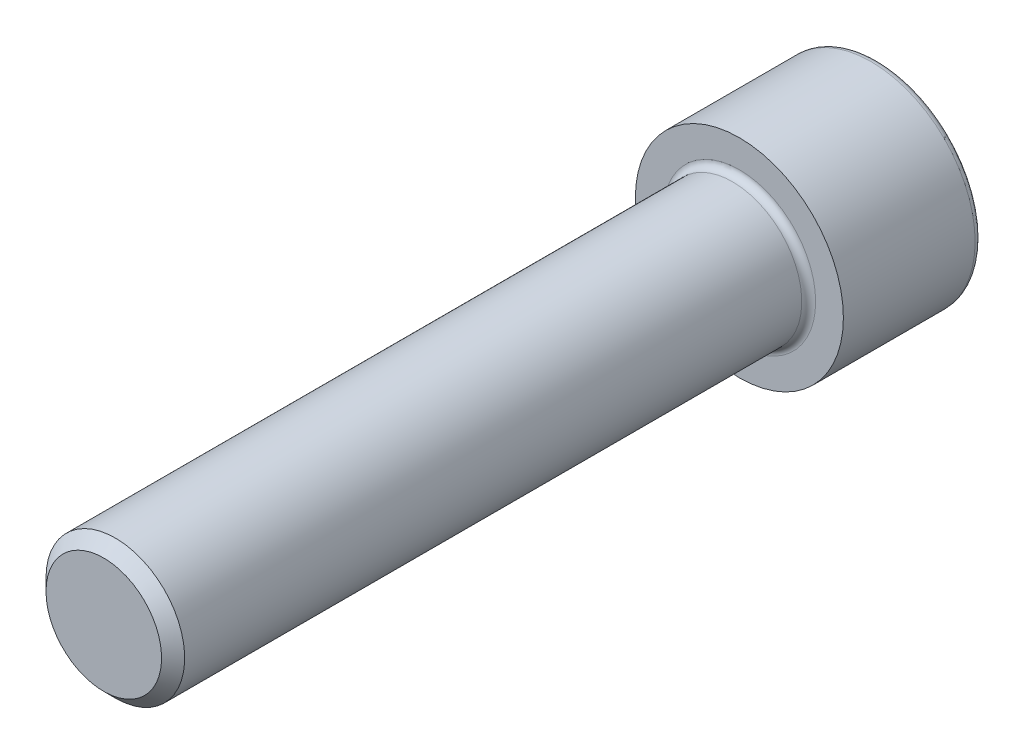
ISO-10303-21;
HEADER;
FILE_DESCRIPTION(('STEP AP214'),'2;1');
FILE_NAME('part.step','',(''),(''),'','','');
FILE_SCHEMA(('AUTOMOTIVE_DESIGN { 1 0 10303 214 1 1 1 1 }'));
ENDSEC;
DATA;
#1=APPLICATION_CONTEXT('core data for automotive mechanical design processes');
#2=APPLICATION_PROTOCOL_DEFINITION('international standard','automotive_design',2000,#1);
#3=PRODUCT_CONTEXT('',#1,'mechanical');
#4=PRODUCT('Part','Part','',(#3));
#5=PRODUCT_RELATED_PRODUCT_CATEGORY('part','',(#4));
#6=PRODUCT_DEFINITION_FORMATION('','',#4);
#7=PRODUCT_DEFINITION_CONTEXT('part definition',#1,'design');
#8=PRODUCT_DEFINITION('design','',#6,#7);
#9=PRODUCT_DEFINITION_SHAPE('','',#8);
#10=(LENGTH_UNIT() NAMED_UNIT(*) SI_UNIT(.MILLI.,.METRE.));
#11=(NAMED_UNIT(*) PLANE_ANGLE_UNIT() SI_UNIT($,.RADIAN.));
#12=(NAMED_UNIT(*) SI_UNIT($,.STERADIAN.) SOLID_ANGLE_UNIT());
#13=UNCERTAINTY_MEASURE_WITH_UNIT(LENGTH_MEASURE(1.E-05),#10,'distance_accuracy_value','');
#14=(GEOMETRIC_REPRESENTATION_CONTEXT(3) GLOBAL_UNCERTAINTY_ASSIGNED_CONTEXT((#13)) GLOBAL_UNIT_ASSIGNED_CONTEXT((#10,
#11,#12)) REPRESENTATION_CONTEXT('',''));
#15=CARTESIAN_POINT('',(0.,0.,0.));
#16=DIRECTION('',(0.,0.,1.));
#17=DIRECTION('',(1.,0.,0.));
#18=AXIS2_PLACEMENT_3D('',#15,#16,#17);
#19=CARTESIAN_POINT('',(0.,2.58905958954933E-07,-61.0000001301501));
#20=DIRECTION('',(0.,0.,-1.));
#21=DIRECTION('',(-1.,0.,0.));
#22=AXIS2_PLACEMENT_3D('',#19,#20,#21);
#23=CONICAL_SURFACE('',#22,5.00000021430971,1.04719754987744);
#24=CARTESIAN_POINT('',(-3.41060513164848E-10,2.59092303167563E-07,-58.113248652262));
#25=VERTEX_POINT('',#24);
#26=VERTEX_LOOP('',#25);
#27=FACE_BOUND('',#26,.T.);
#28=CARTESIAN_POINT('',(0.,2.58905959E-07,-61.0000000048103));
#29=DIRECTION('',(0.,0.,-1.));
#30=DIRECTION('',(0.877582561889793,-0.479425538605265,0.));
#31=AXIS2_PLACEMENT_3D('',#28,#29,#30);
#32=CIRCLE('',#31,4.99999999724702);
#33=CARTESIAN_POINT('',(-4.32955801739345,2.5009855340514,-61.0000000048196));
#34=VERTEX_POINT('',#33);
#35=CARTESIAN_POINT('',(-4.33069579146422,2.49901485155329,-61.0000000048196));
#36=VERTEX_POINT('',#35);
#37=EDGE_CURVE('E97',#34,#36,#32,.F.);
#38=ORIENTED_EDGE('',*,*,#37,.F.);
#39=CARTESIAN_POINT('',(0.,2.58905958954933E-07,-61.0000000048288));
#40=DIRECTION('',(0.,0.,-1.));
#41=DIRECTION('',(-1.,0.,0.));
#42=AXIS2_PLACEMENT_3D('',#39,#40,#41);
#43=CIRCLE('',#42,4.99999999724702);
#44=CARTESIAN_POINT('',(-0.0016090554776554,4.99999999724702,-61.0000000048196));
#45=VERTEX_POINT('',#44);
#46=EDGE_CURVE('E20',#34,#45,#43,.T.);
#47=ORIENTED_EDGE('',*,*,#46,.T.);
#48=CARTESIAN_POINT('',(0.,2.58905959E-07,-61.0000000048103));
#49=DIRECTION('',(0.,0.,-1.));
#50=DIRECTION('',(0.877582561889793,-0.479425538605265,0.));
#51=AXIS2_PLACEMENT_3D('',#48,#49,#50);
#52=CIRCLE('',#51,4.99999999724702);
#53=CARTESIAN_POINT('',(0.00160905547763964,4.99999999724702,-61.0000000048196));
#54=VERTEX_POINT('',#53);
#55=EDGE_CURVE('E106',#54,#45,#52,.F.);
#56=ORIENTED_EDGE('',*,*,#55,.F.);
#57=CARTESIAN_POINT('',(0.,2.58905958954933E-07,-61.0000000048288));
#58=DIRECTION('',(0.,0.,-1.));
#59=DIRECTION('',(-1.,0.,0.));
#60=AXIS2_PLACEMENT_3D('',#57,#58,#59);
#61=CIRCLE('',#60,4.99999999724702);
#62=CARTESIAN_POINT('',(4.32955811150432,2.50098558836334,-61.0000000675463));
#63=VERTEX_POINT('',#62);
#64=EDGE_CURVE('E114',#54,#63,#61,.T.);
#65=ORIENTED_EDGE('',*,*,#64,.T.);
#66=CARTESIAN_POINT('',(0.,2.58905959E-07,-61.0000001302637));
#67=DIRECTION('',(0.,0.,-1.));
#68=DIRECTION('',(0.877582561889051,-0.479425538606623,0.));
#69=AXIS2_PLACEMENT_3D('',#66,#67,#68);
#70=CIRCLE('',#69,5.00000021456376);
#71=CARTESIAN_POINT('',(4.33069590657441,2.49901491800317,-61.0000000815499));
#72=VERTEX_POINT('',#71);
#73=EDGE_CURVE('E133',#72,#63,#70,.F.);
#74=ORIENTED_EDGE('',*,*,#73,.F.);
#75=CARTESIAN_POINT('',(0.,2.58905958954933E-07,-61.000000032836));
#76=DIRECTION('',(0.,0.,-1.));
#77=DIRECTION('',(-1.,0.,0.));
#78=AXIS2_PLACEMENT_3D('',#75,#76,#77);
#79=CIRCLE('',#78,5.00000004575687);
#80=CARTESIAN_POINT('',(4.33013370935878,-2.49998832806004,-61.0000000468619));
#81=VERTEX_POINT('',#80);
#82=EDGE_CURVE('E150',#72,#81,#79,.T.);
#83=ORIENTED_EDGE('',*,*,#82,.T.);
#84=CARTESIAN_POINT('',(0.,2.58905958954933E-07,-61.0000000608877));
#85=DIRECTION('',(0.,0.,-1.));
#86=DIRECTION('',(-1.,0.,0.));
#87=AXIS2_PLACEMENT_3D('',#84,#85,#86);
#88=CIRCLE('',#87,5.00000009434387);
#89=CARTESIAN_POINT('',(-1.67829667138371E-10,-4.99999991771895,-61.0000000304439));
#90=VERTEX_POINT('',#89);
#91=EDGE_CURVE('E148',#81,#90,#88,.T.);
#92=ORIENTED_EDGE('',*,*,#91,.T.);
#93=CARTESIAN_POINT('',(0.,2.58905958954933E-07,-61.0000000173853));
#94=DIRECTION('',(0.,0.,-1.));
#95=DIRECTION('',(-1.,0.,0.));
#96=AXIS2_PLACEMENT_3D('',#93,#94,#95);
#97=CIRCLE('',#96,5.00000001899546);
#98=CARTESIAN_POINT('',(-4.33012889742087,-2.49999663588467,-61.0000000111071));
#99=VERTEX_POINT('',#98);
#100=EDGE_CURVE('E146',#90,#99,#97,.T.);
#101=ORIENTED_EDGE('',*,*,#100,.T.);
#102=CARTESIAN_POINT('',(0.,2.58905958954933E-07,-61.0000000048288));
#103=DIRECTION('',(0.,0.,-1.));
#104=DIRECTION('',(-1.,0.,0.));
#105=AXIS2_PLACEMENT_3D('',#102,#103,#104);
#106=CIRCLE('',#105,4.99999999724702);
#107=EDGE_CURVE('E101',#99,#36,#106,.T.);
#108=ORIENTED_EDGE('',*,*,#107,.T.);
#109=EDGE_LOOP('',(#38,#47,#56,#65,#74,#83,#92,#101,#108));
#110=FACE_BOUND('',#109,.T.);
#111=ADVANCED_FACE('F17',(#27,#110),#23,.F.);
#112=CARTESIAN_POINT('',(0.,0.,-61.));
#113=DIRECTION('',(0.,0.,1.));
#114=DIRECTION('',(1.,0.,0.));
#115=AXIS2_PLACEMENT_3D('',#112,#113,#114);
#116=PLANE('',#115);
#117=ORIENTED_EDGE('',*,*,#46,.F.);
#118=DIRECTION('',(-0.50000000000019,-0.866025403784329,0.));
#119=VECTOR('',#118,1.);
#120=CARTESIAN_POINT('',(-2.88675134595,5.,-61.));
#121=LINE('',#120,#119);
#122=CARTESIAN_POINT('',(-2.88675134595,5.,-61.));
#123=VERTEX_POINT('',#122);
#124=EDGE_CURVE('E110',#34,#123,#121,.F.);
#125=ORIENTED_EDGE('',*,*,#124,.T.);
#126=DIRECTION('',(1.,0.,0.));
#127=VECTOR('',#126,1.);
#128=CARTESIAN_POINT('',(2.88675134595,5.,-61.));
#129=LINE('',#128,#127);
#130=EDGE_CURVE('E113',#123,#45,#129,.T.);
#131=ORIENTED_EDGE('',*,*,#130,.T.);
#132=EDGE_LOOP('',(#117,#125,#131));
#133=FACE_BOUND('',#132,.T.);
#134=ADVANCED_FACE('F109',(#133),#116,.F.);
#135=CARTESIAN_POINT('',(0.,0.,-61.));
#136=DIRECTION('',(0.,0.,1.));
#137=DIRECTION('',(1.,0.,0.));
#138=AXIS2_PLACEMENT_3D('',#135,#136,#137);
#139=PLANE('',#138);
#140=ORIENTED_EDGE('',*,*,#64,.F.);
#141=DIRECTION('',(1.,0.,0.));
#142=VECTOR('',#141,1.);
#143=CARTESIAN_POINT('',(2.88675134595,5.,-61.));
#144=LINE('',#143,#142);
#145=CARTESIAN_POINT('',(2.8867513459502,5.00000000000012,-61.));
#146=VERTEX_POINT('',#145);
#147=EDGE_CURVE('E160',#54,#146,#144,.T.);
#148=ORIENTED_EDGE('',*,*,#147,.T.);
#149=DIRECTION('',(-0.50000000000019,0.866025403784329,0.));
#150=VECTOR('',#149,1.);
#151=CARTESIAN_POINT('',(5.7735026919,0.,-61.));
#152=LINE('',#151,#150);
#153=EDGE_CURVE('E158',#146,#63,#152,.F.);
#154=ORIENTED_EDGE('',*,*,#153,.T.);
#155=EDGE_LOOP('',(#140,#148,#154));
#156=FACE_BOUND('',#155,.T.);
#157=ADVANCED_FACE('F159',(#156),#139,.F.);
#158=CARTESIAN_POINT('',(0.,0.,-61.));
#159=DIRECTION('',(0.,0.,1.));
#160=DIRECTION('',(1.,0.,0.));
#161=AXIS2_PLACEMENT_3D('',#158,#159,#160);
#162=PLANE('',#161);
#163=ORIENTED_EDGE('',*,*,#82,.F.);
#164=DIRECTION('',(-0.50000000000019,0.866025403784329,0.));
#165=VECTOR('',#164,1.);
#166=CARTESIAN_POINT('',(5.7735026919,0.,-60.9999999992792));
#167=LINE('',#166,#165);
#168=CARTESIAN_POINT('',(5.7735026918998,1.19937335520785E-13,-60.9999999997597));
#169=VERTEX_POINT('',#168);
#170=EDGE_CURVE('E164',#72,#169,#167,.F.);
#171=ORIENTED_EDGE('',*,*,#170,.T.);
#172=DIRECTION('',(0.50000000000019,0.866025403784329,0.));
#173=VECTOR('',#172,1.);
#174=CARTESIAN_POINT('',(2.88675134595,-5.,-61.));
#175=LINE('',#174,#173);
#176=EDGE_CURVE('E200',#169,#81,#175,.F.);
#177=ORIENTED_EDGE('',*,*,#176,.T.);
#178=EDGE_LOOP('',(#163,#171,#177));
#179=FACE_BOUND('',#178,.T.);
#180=ADVANCED_FACE('F480',(#179),#162,.F.);
#181=CARTESIAN_POINT('',(0.,0.,-61.));
#182=DIRECTION('',(0.,0.,1.));
#183=DIRECTION('',(1.,0.,0.));
#184=AXIS2_PLACEMENT_3D('',#181,#182,#183);
#185=PLANE('',#184);
#186=ORIENTED_EDGE('',*,*,#91,.F.);
#187=DIRECTION('',(0.50000000000019,0.866025403784329,0.));
#188=VECTOR('',#187,1.);
#189=CARTESIAN_POINT('',(2.88675134595,-5.,-61.0000000000101));
#190=LINE('',#189,#188);
#191=CARTESIAN_POINT('',(2.88675134595,-5.,-61.0000000000034));
#192=VERTEX_POINT('',#191);
#193=EDGE_CURVE('E205',#81,#192,#190,.F.);
#194=ORIENTED_EDGE('',*,*,#193,.T.);
#195=DIRECTION('',(1.,0.,0.));
#196=VECTOR('',#195,1.);
#197=CARTESIAN_POINT('',(-2.88675134595,-5.,-61.));
#198=LINE('',#197,#196);
#199=EDGE_CURVE('E216',#192,#90,#198,.F.);
#200=ORIENTED_EDGE('',*,*,#199,.T.);
#201=EDGE_LOOP('',(#186,#194,#200));
#202=FACE_BOUND('',#201,.T.);
#203=ADVANCED_FACE('F470',(#202),#185,.F.);
#204=CARTESIAN_POINT('',(0.,0.,-61.));
#205=DIRECTION('',(0.,0.,1.));
#206=DIRECTION('',(1.,0.,0.));
#207=AXIS2_PLACEMENT_3D('',#204,#205,#206);
#208=PLANE('',#207);
#209=ORIENTED_EDGE('',*,*,#100,.F.);
#210=DIRECTION('',(1.,0.,0.));
#211=VECTOR('',#210,1.);
#212=CARTESIAN_POINT('',(-2.88675134595,-5.,-61.0000000000087));
#213=LINE('',#212,#211);
#214=CARTESIAN_POINT('',(-2.88675134595021,-5.00000000000012,-61.0000000000029));
#215=VERTEX_POINT('',#214);
#216=EDGE_CURVE('E221',#90,#215,#213,.F.);
#217=ORIENTED_EDGE('',*,*,#216,.T.);
#218=DIRECTION('',(0.50000000000019,-0.866025403784329,0.));
#219=VECTOR('',#218,1.);
#220=CARTESIAN_POINT('',(-5.7735026919,0.,-61.));
#221=LINE('',#220,#219);
#222=EDGE_CURVE('E238',#215,#99,#221,.F.);
#223=ORIENTED_EDGE('',*,*,#222,.T.);
#224=EDGE_LOOP('',(#209,#217,#223));
#225=FACE_BOUND('',#224,.T.);
#226=ADVANCED_FACE('F460',(#225),#208,.F.);
#227=CARTESIAN_POINT('',(0.,0.,-61.));
#228=DIRECTION('',(0.,0.,1.));
#229=DIRECTION('',(1.,0.,0.));
#230=AXIS2_PLACEMENT_3D('',#227,#228,#229);
#231=PLANE('',#230);
#232=ORIENTED_EDGE('',*,*,#107,.F.);
#233=DIRECTION('',(0.50000000000019,-0.866025403784329,0.));
#234=VECTOR('',#233,1.);
#235=CARTESIAN_POINT('',(-5.7735026919,0.,-60.9999999845561));
#236=LINE('',#235,#234);
#237=CARTESIAN_POINT('',(-5.77350269189988,-1.15868320693607E-13,-60.9999999922781));
#238=VERTEX_POINT('',#237);
#239=EDGE_CURVE('E243',#99,#238,#236,.F.);
#240=ORIENTED_EDGE('',*,*,#239,.T.);
#241=DIRECTION('',(-0.50000000000019,-0.866025403784329,0.));
#242=VECTOR('',#241,1.);
#243=CARTESIAN_POINT('',(-2.88675134595,5.,-61.));
#244=LINE('',#243,#242);
#245=EDGE_CURVE('E118',#238,#36,#244,.F.);
#246=ORIENTED_EDGE('',*,*,#245,.T.);
#247=EDGE_LOOP('',(#232,#240,#246));
#248=FACE_BOUND('',#247,.T.);
#249=ADVANCED_FACE('F451',(#248),#231,.F.);
#250=CARTESIAN_POINT('',(-2.88675134595,5.,-67.));
#251=DIRECTION('',(-0.866025403784329,0.50000000000019,0.));
#252=DIRECTION('',(-0.50000000000019,-0.866025403784329,0.));
#253=AXIS2_PLACEMENT_3D('',#250,#251,#252);
#254=PLANE('',#253);
#255=DIRECTION('',(0.,0.,1.));
#256=VECTOR('',#255,1.);
#257=CARTESIAN_POINT('',(-2.88675134595,5.,-67.));
#258=LINE('',#257,#256);
#259=CARTESIAN_POINT('',(-2.88675134595,5.,-67.));
#260=VERTEX_POINT('',#259);
#261=EDGE_CURVE('E117',#260,#123,#258,.T.);
#262=ORIENTED_EDGE('',*,*,#261,.T.);
#263=ORIENTED_EDGE('',*,*,#124,.F.);
#264=ORIENTED_EDGE('',*,*,#37,.T.);
#265=ORIENTED_EDGE('',*,*,#245,.F.);
#266=DIRECTION('',(0.,0.,1.));
#267=VECTOR('',#266,1.);
#268=CARTESIAN_POINT('',(-5.7735026919,0.,-67.));
#269=LINE('',#268,#267);
#270=CARTESIAN_POINT('',(-5.77350269189985,0.,-67.));
#271=VERTEX_POINT('',#270);
#272=EDGE_CURVE('E130',#238,#271,#269,.F.);
#273=ORIENTED_EDGE('',*,*,#272,.T.);
#274=DIRECTION('',(0.500000000000243,0.866025403784298,0.));
#275=VECTOR('',#274,1.);
#276=CARTESIAN_POINT('',(-5.7735026919,0.,-67.));
#277=LINE('',#276,#275);
#278=EDGE_CURVE('E127',#271,#260,#277,.T.);
#279=ORIENTED_EDGE('',*,*,#278,.T.);
#280=EDGE_LOOP('',(#262,#263,#264,#265,#273,#279));
#281=FACE_BOUND('',#280,.T.);
#282=ADVANCED_FACE('F115',(#281),#254,.F.);
#283=CARTESIAN_POINT('',(2.88675134595,5.,-67.));
#284=DIRECTION('',(0.,1.,0.));
#285=DIRECTION('',(0.,0.,1.));
#286=AXIS2_PLACEMENT_3D('',#283,#284,#285);
#287=PLANE('',#286);
#288=ORIENTED_EDGE('',*,*,#55,.T.);
#289=ORIENTED_EDGE('',*,*,#130,.F.);
#290=ORIENTED_EDGE('',*,*,#261,.F.);
#291=DIRECTION('',(1.,0.,0.));
#292=VECTOR('',#291,1.);
#293=CARTESIAN_POINT('',(0.,5.,-67.));
#294=LINE('',#293,#292);
#295=CARTESIAN_POINT('',(2.88675134595015,5.00000000000009,-67.));
#296=VERTEX_POINT('',#295);
#297=EDGE_CURVE('E129',#260,#296,#294,.T.);
#298=ORIENTED_EDGE('',*,*,#297,.T.);
#299=DIRECTION('',(0.,0.,1.));
#300=VECTOR('',#299,1.);
#301=CARTESIAN_POINT('',(2.88675134595031,5.00000000000018,-67.));
#302=LINE('',#301,#300);
#303=EDGE_CURVE('E165',#296,#146,#302,.T.);
#304=ORIENTED_EDGE('',*,*,#303,.T.);
#305=ORIENTED_EDGE('',*,*,#147,.F.);
#306=EDGE_LOOP('',(#288,#289,#290,#298,#304,#305));
#307=FACE_BOUND('',#306,.T.);
#308=ADVANCED_FACE('F434',(#307),#287,.F.);
#309=CARTESIAN_POINT('',(5.7735026919,0.,-67.));
#310=DIRECTION('',(0.866025403784329,0.50000000000019,0.));
#311=DIRECTION('',(-0.50000000000019,0.866025403784329,0.));
#312=AXIS2_PLACEMENT_3D('',#309,#310,#311);
#313=PLANE('',#312);
#314=ORIENTED_EDGE('',*,*,#73,.T.);
#315=ORIENTED_EDGE('',*,*,#153,.F.);
#316=ORIENTED_EDGE('',*,*,#303,.F.);
#317=DIRECTION('',(0.500000000000243,-0.866025403784298,0.));
#318=VECTOR('',#317,1.);
#319=CARTESIAN_POINT('',(2.88675134595,5.,-67.));
#320=LINE('',#319,#318);
#321=CARTESIAN_POINT('',(5.77350269189985,0.,-67.));
#322=VERTEX_POINT('',#321);
#323=EDGE_CURVE('E182',#296,#322,#320,.T.);
#324=ORIENTED_EDGE('',*,*,#323,.T.);
#325=DIRECTION('',(0.,0.,1.));
#326=VECTOR('',#325,1.);
#327=CARTESIAN_POINT('',(5.77350269189969,1.78676518025611E-13,-67.));
#328=LINE('',#327,#326);
#329=EDGE_CURVE('E167',#322,#169,#328,.T.);
#330=ORIENTED_EDGE('',*,*,#329,.T.);
#331=ORIENTED_EDGE('',*,*,#170,.F.);
#332=EDGE_LOOP('',(#314,#315,#316,#324,#330,#331));
#333=FACE_BOUND('',#332,.T.);
#334=ADVANCED_FACE('F424',(#333),#313,.F.);
#335=CARTESIAN_POINT('',(2.88675134595,-5.,-67.));
#336=DIRECTION('',(0.866025403784329,-0.50000000000019,0.));
#337=DIRECTION('',(0.50000000000019,0.866025403784329,0.));
#338=AXIS2_PLACEMENT_3D('',#335,#336,#337);
#339=PLANE('',#338);
#340=ORIENTED_EDGE('',*,*,#176,.F.);
#341=ORIENTED_EDGE('',*,*,#329,.F.);
#342=DIRECTION('',(-0.500000000000243,-0.866025403784298,0.));
#343=VECTOR('',#342,1.);
#344=CARTESIAN_POINT('',(5.7735026919,0.,-67.));
#345=LINE('',#344,#343);
#346=CARTESIAN_POINT('',(2.88675134595,-5.,-67.));
#347=VERTEX_POINT('',#346);
#348=EDGE_CURVE('E189',#322,#347,#345,.T.);
#349=ORIENTED_EDGE('',*,*,#348,.T.);
#350=DIRECTION('',(0.,0.,-1.));
#351=VECTOR('',#350,1.);
#352=CARTESIAN_POINT('',(2.88675134595,-5.,-67.));
#353=LINE('',#352,#351);
#354=EDGE_CURVE('E211',#347,#192,#353,.F.);
#355=ORIENTED_EDGE('',*,*,#354,.T.);
#356=ORIENTED_EDGE('',*,*,#193,.F.);
#357=EDGE_LOOP('',(#340,#341,#349,#355,#356));
#358=FACE_BOUND('',#357,.T.);
#359=ADVANCED_FACE('F415',(#358),#339,.F.);
#360=CARTESIAN_POINT('',(-2.88675134595,-5.,-67.));
#361=DIRECTION('',(0.,-1.,0.));
#362=DIRECTION('',(0.,0.,-1.));
#363=AXIS2_PLACEMENT_3D('',#360,#361,#362);
#364=PLANE('',#363);
#365=ORIENTED_EDGE('',*,*,#199,.F.);
#366=ORIENTED_EDGE('',*,*,#354,.F.);
#367=DIRECTION('',(1.,0.,0.));
#368=VECTOR('',#367,1.);
#369=CARTESIAN_POINT('',(0.,-5.,-67.));
#370=LINE('',#369,#368);
#371=CARTESIAN_POINT('',(-2.88675134595031,-5.00000000000018,-67.));
#372=VERTEX_POINT('',#371);
#373=EDGE_CURVE('E35',#347,#372,#370,.F.);
#374=ORIENTED_EDGE('',*,*,#373,.T.);
#375=DIRECTION('',(0.,0.,1.));
#376=VECTOR('',#375,1.);
#377=CARTESIAN_POINT('',(-2.88675134595031,-5.00000000000018,-67.));
#378=LINE('',#377,#376);
#379=EDGE_CURVE('E234',#372,#215,#378,.T.);
#380=ORIENTED_EDGE('',*,*,#379,.T.);
#381=ORIENTED_EDGE('',*,*,#216,.F.);
#382=EDGE_LOOP('',(#365,#366,#374,#380,#381));
#383=FACE_BOUND('',#382,.T.);
#384=ADVANCED_FACE('F406',(#383),#364,.F.);
#385=CARTESIAN_POINT('',(-5.7735026919,0.,-67.));
#386=DIRECTION('',(-0.866025403784329,-0.50000000000019,0.));
#387=DIRECTION('',(0.50000000000019,-0.866025403784329,0.));
#388=AXIS2_PLACEMENT_3D('',#385,#386,#387);
#389=PLANE('',#388);
#390=ORIENTED_EDGE('',*,*,#272,.F.);
#391=ORIENTED_EDGE('',*,*,#239,.F.);
#392=ORIENTED_EDGE('',*,*,#222,.F.);
#393=ORIENTED_EDGE('',*,*,#379,.F.);
#394=DIRECTION('',(-0.500000000000243,0.866025403784298,0.));
#395=VECTOR('',#394,1.);
#396=CARTESIAN_POINT('',(-2.88675134595,-5.,-67.));
#397=LINE('',#396,#395);
#398=EDGE_CURVE('E224',#372,#271,#397,.T.);
#399=ORIENTED_EDGE('',*,*,#398,.T.);
#400=EDGE_LOOP('',(#390,#391,#392,#393,#399));
#401=FACE_BOUND('',#400,.T.);
#402=ADVANCED_FACE('F397',(#401),#389,.F.);
#403=CARTESIAN_POINT('',(0.,0.,-67.));
#404=DIRECTION('',(0.,0.,1.));
#405=DIRECTION('',(1.,0.,0.));
#406=AXIS2_PLACEMENT_3D('',#403,#404,#405);
#407=PLANE('',#406);
#408=ORIENTED_EDGE('',*,*,#373,.F.);
#409=ORIENTED_EDGE('',*,*,#348,.F.);
#410=ORIENTED_EDGE('',*,*,#323,.F.);
#411=ORIENTED_EDGE('',*,*,#297,.F.);
#412=ORIENTED_EDGE('',*,*,#278,.F.);
#413=ORIENTED_EDGE('',*,*,#398,.F.);
#414=EDGE_LOOP('',(#408,#409,#410,#411,#412,#413));
#415=FACE_BOUND('',#414,.T.);
#416=CARTESIAN_POINT('',(0.,0.,-67.));
#417=DIRECTION('',(0.,0.,1.));
#418=DIRECTION('',(1.,0.,0.));
#419=AXIS2_PLACEMENT_3D('',#416,#417,#418);
#420=CIRCLE('',#419,8.4);
#421=CARTESIAN_POINT('',(8.4,0.,-67.));
#422=VERTEX_POINT('',#421);
#423=EDGE_CURVE('E227',#422,#422,#420,.T.);
#424=ORIENTED_EDGE('',*,*,#423,.F.);
#425=EDGE_LOOP('',(#424));
#426=FACE_BOUND('',#425,.T.);
#427=ADVANCED_FACE('F271',(#415,#426),#407,.F.);
#428=CARTESIAN_POINT('',(0.,0.,-66.4));
#429=DIRECTION('',(0.,0.,-1.));
#430=DIRECTION('',(1.,0.,0.));
#431=AXIS2_PLACEMENT_3D('',#428,#429,#430);
#432=TOROIDAL_SURFACE('',#431,8.4,0.6);
#433=CARTESIAN_POINT('',(0.,0.,-66.4));
#434=DIRECTION('',(0.,0.,1.));
#435=DIRECTION('',(1.,0.,0.));
#436=AXIS2_PLACEMENT_3D('',#433,#434,#435);
#437=CIRCLE('',#436,9.);
#438=CARTESIAN_POINT('',(9.,0.,-66.4));
#439=VERTEX_POINT('',#438);
#440=EDGE_CURVE('E144',#439,#439,#437,.T.);
#441=ORIENTED_EDGE('',*,*,#440,.F.);
#442=EDGE_LOOP('',(#441));
#443=FACE_BOUND('',#442,.T.);
#444=ORIENTED_EDGE('',*,*,#423,.T.);
#445=EDGE_LOOP('',(#444));
#446=FACE_BOUND('',#445,.T.);
#447=ADVANCED_FACE('F259',(#443,#446),#432,.T.);
#448=CARTESIAN_POINT('',(0.,0.,-33.5));
#449=DIRECTION('',(0.,0.,1.));
#450=DIRECTION('',(1.,0.,0.));
#451=AXIS2_PLACEMENT_3D('',#448,#449,#450);
#452=CYLINDRICAL_SURFACE('',#451,9.);
#453=CARTESIAN_POINT('',(0.,0.,-55.));
#454=DIRECTION('',(0.,0.,1.));
#455=DIRECTION('',(1.,0.,0.));
#456=AXIS2_PLACEMENT_3D('',#453,#454,#455);
#457=CIRCLE('',#456,9.);
#458=CARTESIAN_POINT('',(9.,0.,-55.));
#459=VERTEX_POINT('',#458);
#460=EDGE_CURVE('E141',#459,#459,#457,.F.);
#461=ORIENTED_EDGE('',*,*,#460,.T.);
#462=EDGE_LOOP('',(#461));
#463=FACE_BOUND('',#462,.T.);
#464=ORIENTED_EDGE('',*,*,#440,.T.);
#465=EDGE_LOOP('',(#464));
#466=FACE_BOUND('',#465,.T.);
#467=ADVANCED_FACE('F270',(#463,#466),#452,.T.);
#468=CARTESIAN_POINT('',(0.,0.,-55.));
#469=DIRECTION('',(0.,0.,-1.));
#470=DIRECTION('',(-1.,0.,0.));
#471=AXIS2_PLACEMENT_3D('',#468,#469,#470);
#472=PLANE('',#471);
#473=CARTESIAN_POINT('',(0.,0.,-55.));
#474=DIRECTION('',(0.,0.,1.));
#475=DIRECTION('',(1.,0.,0.));
#476=AXIS2_PLACEMENT_3D('',#473,#474,#475);
#477=CIRCLE('',#476,6.60000000000001);
#478=CARTESIAN_POINT('',(6.6,0.,-55.));
#479=VERTEX_POINT('',#478);
#480=EDGE_CURVE('E140',#479,#479,#477,.F.);
#481=ORIENTED_EDGE('',*,*,#480,.T.);
#482=EDGE_LOOP('',(#481));
#483=FACE_BOUND('',#482,.T.);
#484=ORIENTED_EDGE('',*,*,#460,.F.);
#485=EDGE_LOOP('',(#484));
#486=FACE_BOUND('',#485,.T.);
#487=ADVANCED_FACE('F325',(#483,#486),#472,.F.);
#488=CARTESIAN_POINT('',(0.,0.,0.));
#489=DIRECTION('',(0.,0.,1.));
#490=DIRECTION('',(1.,0.,0.));
#491=AXIS2_PLACEMENT_3D('',#488,#489,#490);
#492=PLANE('',#491);
#493=CARTESIAN_POINT('',(0.,0.,-3.5811353882309E-09));
#494=DIRECTION('',(0.,0.,-1.));
#495=DIRECTION('',(-1.,0.,0.));
#496=AXIS2_PLACEMENT_3D('',#493,#494,#495);
#497=CIRCLE('',#496,4.99999999647116);
#498=CARTESIAN_POINT('',(-4.99999999647117,0.,-3.5811353882309E-09));
#499=VERTEX_POINT('',#498);
#500=EDGE_CURVE('E137',#499,#499,#497,.T.);
#501=ORIENTED_EDGE('',*,*,#500,.F.);
#502=EDGE_LOOP('',(#501));
#503=FACE_BOUND('',#502,.T.);
#504=ADVANCED_FACE('F313',(#503),#492,.T.);
#505=CARTESIAN_POINT('',(0.,0.,-54.4));
#506=DIRECTION('',(0.,0.,1.));
#507=DIRECTION('',(-1.,0.,0.));
#508=AXIS2_PLACEMENT_3D('',#505,#506,#507);
#509=TOROIDAL_SURFACE('',#508,6.6,0.6);
#510=ORIENTED_EDGE('',*,*,#480,.F.);
#511=EDGE_LOOP('',(#510));
#512=FACE_BOUND('',#511,.T.);
#513=CARTESIAN_POINT('',(0.,0.,-54.4));
#514=DIRECTION('',(0.,0.,-1.));
#515=DIRECTION('',(-1.,0.,0.));
#516=AXIS2_PLACEMENT_3D('',#513,#514,#515);
#517=CIRCLE('',#516,6.);
#518=CARTESIAN_POINT('',(-6.,0.,-54.4));
#519=VERTEX_POINT('',#518);
#520=EDGE_CURVE('E26',#519,#519,#517,.F.);
#521=ORIENTED_EDGE('',*,*,#520,.F.);
#522=EDGE_LOOP('',(#521));
#523=FACE_BOUND('',#522,.T.);
#524=ADVANCED_FACE('F301',(#512,#523),#509,.F.);
#525=CARTESIAN_POINT('',(0.,0.,-1.00000000441014));
#526=DIRECTION('',(0.,0.,-1.));
#527=DIRECTION('',(-1.,0.,0.));
#528=AXIS2_PLACEMENT_3D('',#525,#526,#527);
#529=CONICAL_SURFACE('',#528,5.99999999542434,0.785398162459532);
#530=CARTESIAN_POINT('',(0.,0.,-1.));
#531=DIRECTION('',(0.,0.,-1.));
#532=DIRECTION('',(-1.,0.,0.));
#533=AXIS2_PLACEMENT_3D('',#530,#531,#532);
#534=CIRCLE('',#533,6.);
#535=CARTESIAN_POINT('',(-6.,0.,-1.));
#536=VERTEX_POINT('',#535);
#537=EDGE_CURVE('E11',#536,#536,#534,.T.);
#538=ORIENTED_EDGE('',*,*,#537,.F.);
#539=EDGE_LOOP('',(#538));
#540=FACE_BOUND('',#539,.T.);
#541=ORIENTED_EDGE('',*,*,#500,.T.);
#542=EDGE_LOOP('',(#541));
#543=FACE_BOUND('',#542,.T.);
#544=ADVANCED_FACE('F312',(#540,#543),#529,.T.);
#545=CARTESIAN_POINT('',(0.,0.,-27.5));
#546=DIRECTION('',(0.,0.,-1.));
#547=DIRECTION('',(-1.,0.,0.));
#548=AXIS2_PLACEMENT_3D('',#545,#546,#547);
#549=CYLINDRICAL_SURFACE('',#548,6.);
#550=ORIENTED_EDGE('',*,*,#537,.T.);
#551=EDGE_LOOP('',(#550));
#552=FACE_BOUND('',#551,.T.);
#553=ORIENTED_EDGE('',*,*,#520,.T.);
#554=EDGE_LOOP('',(#553));
#555=FACE_BOUND('',#554,.T.);
#556=ADVANCED_FACE('F341',(#552,#555),#549,.T.);
#557=CLOSED_SHELL('',(#111,#134,#157,#180,#203,#226,#249,#282,#308,#334,#359,#384,#402,#427,
#447,#467,#487,#504,#524,#544,#556));
#558=MANIFOLD_SOLID_BREP('B1',#557);
#559=ADVANCED_BREP_SHAPE_REPRESENTATION('',(#18,#558),#14);
#560=SHAPE_DEFINITION_REPRESENTATION(#9,#559);
ENDSEC;
END-ISO-10303-21;
